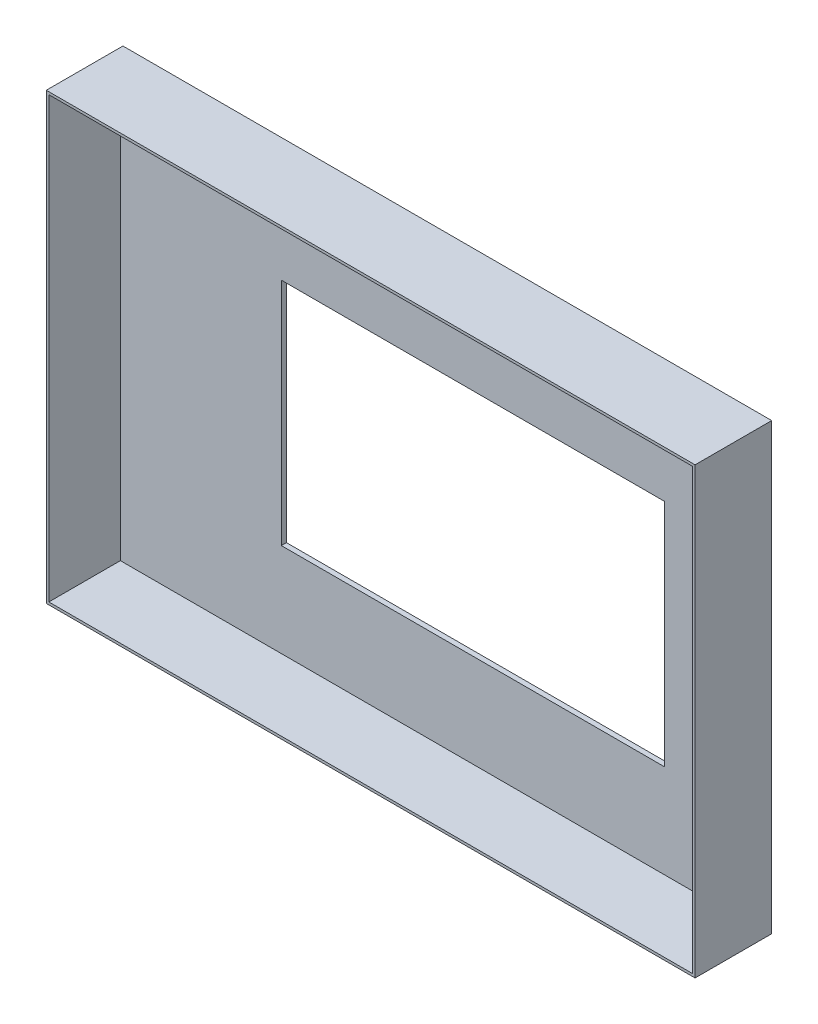
ISO-10303-21;
HEADER;
FILE_DESCRIPTION(('STEP AP214'),'2;1');
FILE_NAME('part.step','',(''),(''),'','','');
FILE_SCHEMA(('AUTOMOTIVE_DESIGN { 1 0 10303 214 1 1 1 1 }'));
ENDSEC;
DATA;
#1=APPLICATION_CONTEXT('core data for automotive mechanical design processes');
#2=APPLICATION_PROTOCOL_DEFINITION('international standard','automotive_design',2000,#1);
#3=PRODUCT_CONTEXT('',#1,'mechanical');
#4=PRODUCT('Part','Part','',(#3));
#5=PRODUCT_RELATED_PRODUCT_CATEGORY('part','',(#4));
#6=PRODUCT_DEFINITION_FORMATION('','',#4);
#7=PRODUCT_DEFINITION_CONTEXT('part definition',#1,'design');
#8=PRODUCT_DEFINITION('design','',#6,#7);
#9=PRODUCT_DEFINITION_SHAPE('','',#8);
#10=(LENGTH_UNIT() NAMED_UNIT(*) SI_UNIT(.MILLI.,.METRE.));
#11=(NAMED_UNIT(*) PLANE_ANGLE_UNIT() SI_UNIT($,.RADIAN.));
#12=(NAMED_UNIT(*) SI_UNIT($,.STERADIAN.) SOLID_ANGLE_UNIT());
#13=UNCERTAINTY_MEASURE_WITH_UNIT(LENGTH_MEASURE(1.E-05),#10,'distance_accuracy_value','');
#14=(GEOMETRIC_REPRESENTATION_CONTEXT(3) GLOBAL_UNCERTAINTY_ASSIGNED_CONTEXT((#13)) GLOBAL_UNIT_ASSIGNED_CONTEXT((#10,
#11,#12)) REPRESENTATION_CONTEXT('',''));
#15=CARTESIAN_POINT('',(0.,0.,0.));
#16=DIRECTION('',(0.,0.,1.));
#17=DIRECTION('',(1.,0.,0.));
#18=AXIS2_PLACEMENT_3D('',#15,#16,#17);
#19=CARTESIAN_POINT('',(0.,0.,0.999999999999999));
#20=DIRECTION('',(0.,0.,1.));
#21=DIRECTION('',(1.,0.,0.));
#22=AXIS2_PLACEMENT_3D('',#19,#20,#21);
#23=PLANE('',#22);
#24=DIRECTION('',(0.,-1.,0.));
#25=VECTOR('',#24,1.);
#26=CARTESIAN_POINT('',(-61.095,26.805,0.999999999999999));
#27=LINE('',#26,#25);
#28=CARTESIAN_POINT('',(-61.095,26.805,0.999999999999999));
#29=VERTEX_POINT('',#28);
#30=CARTESIAN_POINT('',(-61.095,-59.195,0.999999999999999));
#31=VERTEX_POINT('',#30);
#32=EDGE_CURVE('E162',#29,#31,#27,.T.);
#33=ORIENTED_EDGE('',*,*,#32,.T.);
#34=DIRECTION('',(1.,0.,0.));
#35=VECTOR('',#34,1.);
#36=CARTESIAN_POINT('',(-61.095,-59.195,0.999999999999999));
#37=LINE('',#36,#35);
#38=CARTESIAN_POINT('',(64.905,-59.195,0.999999999999999));
#39=VERTEX_POINT('',#38);
#40=EDGE_CURVE('E165',#31,#39,#37,.T.);
#41=ORIENTED_EDGE('',*,*,#40,.T.);
#42=DIRECTION('',(0.,1.,0.));
#43=VECTOR('',#42,1.);
#44=CARTESIAN_POINT('',(64.905,26.805,0.999999999999999));
#45=LINE('',#44,#43);
#46=CARTESIAN_POINT('',(64.905,26.805,0.999999999999999));
#47=VERTEX_POINT('',#46);
#48=EDGE_CURVE('E169',#39,#47,#45,.T.);
#49=ORIENTED_EDGE('',*,*,#48,.T.);
#50=DIRECTION('',(-1.,0.,0.));
#51=VECTOR('',#50,1.);
#52=CARTESIAN_POINT('',(-61.095,26.805,0.999999999999999));
#53=LINE('',#52,#51);
#54=EDGE_CURVE('E172',#47,#29,#53,.T.);
#55=ORIENTED_EDGE('',*,*,#54,.T.);
#56=EDGE_LOOP('',(#33,#41,#49,#55));
#57=FACE_BOUND('',#56,.T.);
#58=DIRECTION('',(1.,0.,0.));
#59=VECTOR('',#58,1.);
#60=CARTESIAN_POINT('',(45.405,4.11652592288495,1.));
#61=LINE('',#60,#59);
#62=CARTESIAN_POINT('',(-29.595,4.11652592288495,1.));
#63=VERTEX_POINT('',#62);
#64=CARTESIAN_POINT('',(45.405,4.11652592288495,1.));
#65=VERTEX_POINT('',#64);
#66=EDGE_CURVE('E135',#63,#65,#61,.T.);
#67=ORIENTED_EDGE('',*,*,#66,.T.);
#68=DIRECTION('',(0.,-1.,0.));
#69=VECTOR('',#68,1.);
#70=CARTESIAN_POINT('',(45.405,4.11652592288495,1.));
#71=LINE('',#70,#69);
#72=CARTESIAN_POINT('',(45.405,-40.883474077115,1.));
#73=VERTEX_POINT('',#72);
#74=EDGE_CURVE('E129',#65,#73,#71,.T.);
#75=ORIENTED_EDGE('',*,*,#74,.T.);
#76=DIRECTION('',(-1.,0.,0.));
#77=VECTOR('',#76,1.);
#78=CARTESIAN_POINT('',(45.405,-40.883474077115,1.));
#79=LINE('',#78,#77);
#80=CARTESIAN_POINT('',(-29.595,-40.883474077115,1.));
#81=VERTEX_POINT('',#80);
#82=EDGE_CURVE('E138',#73,#81,#79,.T.);
#83=ORIENTED_EDGE('',*,*,#82,.T.);
#84=DIRECTION('',(0.,1.,0.));
#85=VECTOR('',#84,1.);
#86=CARTESIAN_POINT('',(-29.595,4.11652592288495,1.));
#87=LINE('',#86,#85);
#88=EDGE_CURVE('E53',#81,#63,#87,.T.);
#89=ORIENTED_EDGE('',*,*,#88,.T.);
#90=EDGE_LOOP('',(#67,#75,#83,#89));
#91=FACE_BOUND('',#90,.T.);
#92=ADVANCED_FACE('F38',(#57,#91),#23,.T.);
#93=CARTESIAN_POINT('',(-61.595,27.305,15.));
#94=DIRECTION('',(1.,0.,0.));
#95=DIRECTION('',(0.,1.,0.));
#96=AXIS2_PLACEMENT_3D('',#93,#94,#95);
#97=PLANE('',#96);
#98=DIRECTION('',(0.,-1.,0.));
#99=VECTOR('',#98,1.);
#100=CARTESIAN_POINT('',(-61.595,27.305,0.));
#101=LINE('',#100,#99);
#102=CARTESIAN_POINT('',(-61.595,27.305,0.));
#103=VERTEX_POINT('',#102);
#104=CARTESIAN_POINT('',(-61.595,-59.695,0.));
#105=VERTEX_POINT('',#104);
#106=EDGE_CURVE('E187',#103,#105,#101,.T.);
#107=ORIENTED_EDGE('',*,*,#106,.T.);
#108=DIRECTION('',(0.,0.,-1.));
#109=VECTOR('',#108,1.);
#110=CARTESIAN_POINT('',(-61.595,-59.695,15.));
#111=LINE('',#110,#109);
#112=CARTESIAN_POINT('',(-61.595,-59.695,15.));
#113=VERTEX_POINT('',#112);
#114=EDGE_CURVE('E11',#113,#105,#111,.T.);
#115=ORIENTED_EDGE('',*,*,#114,.F.);
#116=DIRECTION('',(0.,-1.,0.));
#117=VECTOR('',#116,1.);
#118=CARTESIAN_POINT('',(-61.595,27.305,15.));
#119=LINE('',#118,#117);
#120=CARTESIAN_POINT('',(-61.595,27.305,15.));
#121=VERTEX_POINT('',#120);
#122=EDGE_CURVE('E194',#121,#113,#119,.T.);
#123=ORIENTED_EDGE('',*,*,#122,.F.);
#124=DIRECTION('',(0.,0.,-1.));
#125=VECTOR('',#124,1.);
#126=CARTESIAN_POINT('',(-61.595,27.305,15.));
#127=LINE('',#126,#125);
#128=EDGE_CURVE('E204',#121,#103,#127,.T.);
#129=ORIENTED_EDGE('',*,*,#128,.T.);
#130=EDGE_LOOP('',(#107,#115,#123,#129));
#131=FACE_BOUND('',#130,.T.);
#132=ADVANCED_FACE('F40',(#131),#97,.F.);
#133=CARTESIAN_POINT('',(-61.595,-59.695,15.));
#134=DIRECTION('',(0.,1.,0.));
#135=DIRECTION('',(0.,0.,1.));
#136=AXIS2_PLACEMENT_3D('',#133,#134,#135);
#137=PLANE('',#136);
#138=DIRECTION('',(1.,0.,0.));
#139=VECTOR('',#138,1.);
#140=CARTESIAN_POINT('',(-61.595,-59.695,0.));
#141=LINE('',#140,#139);
#142=CARTESIAN_POINT('',(65.405,-59.695,0.));
#143=VERTEX_POINT('',#142);
#144=EDGE_CURVE('E207',#105,#143,#141,.T.);
#145=ORIENTED_EDGE('',*,*,#144,.T.);
#146=DIRECTION('',(0.,0.,-1.));
#147=VECTOR('',#146,1.);
#148=CARTESIAN_POINT('',(65.405,-59.695,15.));
#149=LINE('',#148,#147);
#150=CARTESIAN_POINT('',(65.405,-59.695,15.));
#151=VERTEX_POINT('',#150);
#152=EDGE_CURVE('E46',#151,#143,#149,.T.);
#153=ORIENTED_EDGE('',*,*,#152,.F.);
#154=DIRECTION('',(1.,0.,0.));
#155=VECTOR('',#154,1.);
#156=CARTESIAN_POINT('',(-61.595,-59.695,15.));
#157=LINE('',#156,#155);
#158=EDGE_CURVE('E197',#113,#151,#157,.T.);
#159=ORIENTED_EDGE('',*,*,#158,.F.);
#160=ORIENTED_EDGE('',*,*,#114,.T.);
#161=EDGE_LOOP('',(#145,#153,#159,#160));
#162=FACE_BOUND('',#161,.T.);
#163=ADVANCED_FACE('F237',(#162),#137,.F.);
#164=CARTESIAN_POINT('',(65.405,27.305,15.));
#165=DIRECTION('',(-1.,0.,0.));
#166=DIRECTION('',(0.,-1.,0.));
#167=AXIS2_PLACEMENT_3D('',#164,#165,#166);
#168=PLANE('',#167);
#169=DIRECTION('',(0.,1.,0.));
#170=VECTOR('',#169,1.);
#171=CARTESIAN_POINT('',(65.405,27.305,0.));
#172=LINE('',#171,#170);
#173=CARTESIAN_POINT('',(65.405,27.305,0.));
#174=VERTEX_POINT('',#173);
#175=EDGE_CURVE('E209',#143,#174,#172,.T.);
#176=ORIENTED_EDGE('',*,*,#175,.T.);
#177=DIRECTION('',(0.,0.,-1.));
#178=VECTOR('',#177,1.);
#179=CARTESIAN_POINT('',(65.405,27.305,15.));
#180=LINE('',#179,#178);
#181=CARTESIAN_POINT('',(65.405,27.305,15.));
#182=VERTEX_POINT('',#181);
#183=EDGE_CURVE('E214',#182,#174,#180,.T.);
#184=ORIENTED_EDGE('',*,*,#183,.F.);
#185=DIRECTION('',(0.,1.,0.));
#186=VECTOR('',#185,1.);
#187=CARTESIAN_POINT('',(65.405,27.305,15.));
#188=LINE('',#187,#186);
#189=EDGE_CURVE('E200',#151,#182,#188,.T.);
#190=ORIENTED_EDGE('',*,*,#189,.F.);
#191=ORIENTED_EDGE('',*,*,#152,.T.);
#192=EDGE_LOOP('',(#176,#184,#190,#191));
#193=FACE_BOUND('',#192,.T.);
#194=ADVANCED_FACE('F221',(#193),#168,.F.);
#195=CARTESIAN_POINT('',(-61.595,27.305,15.));
#196=DIRECTION('',(0.,-1.,0.));
#197=DIRECTION('',(0.,0.,-1.));
#198=AXIS2_PLACEMENT_3D('',#195,#196,#197);
#199=PLANE('',#198);
#200=DIRECTION('',(-1.,0.,0.));
#201=VECTOR('',#200,1.);
#202=CARTESIAN_POINT('',(-61.595,27.305,0.));
#203=LINE('',#202,#201);
#204=EDGE_CURVE('E198',#174,#103,#203,.T.);
#205=ORIENTED_EDGE('',*,*,#204,.T.);
#206=ORIENTED_EDGE('',*,*,#128,.F.);
#207=DIRECTION('',(-1.,0.,0.));
#208=VECTOR('',#207,1.);
#209=CARTESIAN_POINT('',(-61.595,27.305,15.));
#210=LINE('',#209,#208);
#211=EDGE_CURVE('E202',#182,#121,#210,.T.);
#212=ORIENTED_EDGE('',*,*,#211,.F.);
#213=ORIENTED_EDGE('',*,*,#183,.T.);
#214=EDGE_LOOP('',(#205,#206,#212,#213));
#215=FACE_BOUND('',#214,.T.);
#216=ADVANCED_FACE('F230',(#215),#199,.F.);
#217=CARTESIAN_POINT('',(0.,0.,15.));
#218=DIRECTION('',(0.,0.,1.));
#219=DIRECTION('',(1.,0.,0.));
#220=AXIS2_PLACEMENT_3D('',#217,#218,#219);
#221=PLANE('',#220);
#222=DIRECTION('',(0.,-1.,0.));
#223=VECTOR('',#222,1.);
#224=CARTESIAN_POINT('',(-61.095,26.805,15.));
#225=LINE('',#224,#223);
#226=CARTESIAN_POINT('',(-61.095,26.805,15.));
#227=VERTEX_POINT('',#226);
#228=CARTESIAN_POINT('',(-61.095,-59.195,15.));
#229=VERTEX_POINT('',#228);
#230=EDGE_CURVE('E158',#227,#229,#225,.T.);
#231=ORIENTED_EDGE('',*,*,#230,.F.);
#232=DIRECTION('',(-1.,0.,0.));
#233=VECTOR('',#232,1.);
#234=CARTESIAN_POINT('',(-61.095,26.805,15.));
#235=LINE('',#234,#233);
#236=CARTESIAN_POINT('',(64.905,26.805,15.));
#237=VERTEX_POINT('',#236);
#238=EDGE_CURVE('E166',#237,#227,#235,.T.);
#239=ORIENTED_EDGE('',*,*,#238,.F.);
#240=DIRECTION('',(0.,1.,0.));
#241=VECTOR('',#240,1.);
#242=CARTESIAN_POINT('',(64.905,26.805,15.));
#243=LINE('',#242,#241);
#244=CARTESIAN_POINT('',(64.905,-59.195,15.));
#245=VERTEX_POINT('',#244);
#246=EDGE_CURVE('E180',#245,#237,#243,.T.);
#247=ORIENTED_EDGE('',*,*,#246,.F.);
#248=DIRECTION('',(1.,0.,0.));
#249=VECTOR('',#248,1.);
#250=CARTESIAN_POINT('',(-61.095,-59.195,15.));
#251=LINE('',#250,#249);
#252=EDGE_CURVE('E177',#229,#245,#251,.T.);
#253=ORIENTED_EDGE('',*,*,#252,.F.);
#254=EDGE_LOOP('',(#231,#239,#247,#253));
#255=FACE_BOUND('',#254,.T.);
#256=ORIENTED_EDGE('',*,*,#122,.T.);
#257=ORIENTED_EDGE('',*,*,#158,.T.);
#258=ORIENTED_EDGE('',*,*,#189,.T.);
#259=ORIENTED_EDGE('',*,*,#211,.T.);
#260=EDGE_LOOP('',(#256,#257,#258,#259));
#261=FACE_BOUND('',#260,.T.);
#262=ADVANCED_FACE('F236',(#255,#261),#221,.T.);
#263=CARTESIAN_POINT('',(0.,0.,0.));
#264=DIRECTION('',(0.,0.,1.));
#265=DIRECTION('',(1.,0.,0.));
#266=AXIS2_PLACEMENT_3D('',#263,#264,#265);
#267=PLANE('',#266);
#268=DIRECTION('',(-1.,0.,0.));
#269=VECTOR('',#268,1.);
#270=CARTESIAN_POINT('',(45.405,-40.883474077115,0.));
#271=LINE('',#270,#269);
#272=CARTESIAN_POINT('',(45.405,-40.883474077115,0.));
#273=VERTEX_POINT('',#272);
#274=CARTESIAN_POINT('',(-29.595,-40.883474077115,0.));
#275=VERTEX_POINT('',#274);
#276=EDGE_CURVE('E152',#273,#275,#271,.T.);
#277=ORIENTED_EDGE('',*,*,#276,.F.);
#278=DIRECTION('',(0.,-1.,0.));
#279=VECTOR('',#278,1.);
#280=CARTESIAN_POINT('',(45.405,4.11652592288495,0.));
#281=LINE('',#280,#279);
#282=CARTESIAN_POINT('',(45.405,4.11652592288495,0.));
#283=VERTEX_POINT('',#282);
#284=EDGE_CURVE('E61',#283,#273,#281,.T.);
#285=ORIENTED_EDGE('',*,*,#284,.F.);
#286=DIRECTION('',(1.,0.,0.));
#287=VECTOR('',#286,1.);
#288=CARTESIAN_POINT('',(45.405,4.11652592288495,0.));
#289=LINE('',#288,#287);
#290=CARTESIAN_POINT('',(-29.595,4.11652592288495,0.));
#291=VERTEX_POINT('',#290);
#292=EDGE_CURVE('E143',#291,#283,#289,.T.);
#293=ORIENTED_EDGE('',*,*,#292,.F.);
#294=DIRECTION('',(0.,1.,0.));
#295=VECTOR('',#294,1.);
#296=CARTESIAN_POINT('',(-29.595,4.11652592288495,0.));
#297=LINE('',#296,#295);
#298=EDGE_CURVE('E146',#275,#291,#297,.T.);
#299=ORIENTED_EDGE('',*,*,#298,.F.);
#300=EDGE_LOOP('',(#277,#285,#293,#299));
#301=FACE_BOUND('',#300,.T.);
#302=ORIENTED_EDGE('',*,*,#106,.F.);
#303=ORIENTED_EDGE('',*,*,#204,.F.);
#304=ORIENTED_EDGE('',*,*,#175,.F.);
#305=ORIENTED_EDGE('',*,*,#144,.F.);
#306=EDGE_LOOP('',(#302,#303,#304,#305));
#307=FACE_BOUND('',#306,.T.);
#308=ADVANCED_FACE('F227',(#301,#307),#267,.F.);
#309=CARTESIAN_POINT('',(-61.095,26.805,0.999999999999999));
#310=DIRECTION('',(-1.,0.,0.));
#311=DIRECTION('',(0.,-1.,0.));
#312=AXIS2_PLACEMENT_3D('',#309,#310,#311);
#313=PLANE('',#312);
#314=ORIENTED_EDGE('',*,*,#230,.T.);
#315=DIRECTION('',(0.,0.,1.));
#316=VECTOR('',#315,1.);
#317=CARTESIAN_POINT('',(-61.095,-59.195,0.999999999999999));
#318=LINE('',#317,#316);
#319=EDGE_CURVE('E175',#31,#229,#318,.T.);
#320=ORIENTED_EDGE('',*,*,#319,.F.);
#321=ORIENTED_EDGE('',*,*,#32,.F.);
#322=DIRECTION('',(0.,0.,1.));
#323=VECTOR('',#322,1.);
#324=CARTESIAN_POINT('',(-61.095,26.805,0.999999999999999));
#325=LINE('',#324,#323);
#326=EDGE_CURVE('E185',#29,#227,#325,.T.);
#327=ORIENTED_EDGE('',*,*,#326,.T.);
#328=EDGE_LOOP('',(#314,#320,#321,#327));
#329=FACE_BOUND('',#328,.T.);
#330=ADVANCED_FACE('F256',(#329),#313,.F.);
#331=CARTESIAN_POINT('',(-61.095,26.805,0.999999999999999));
#332=DIRECTION('',(0.,1.,0.));
#333=DIRECTION('',(0.,0.,1.));
#334=AXIS2_PLACEMENT_3D('',#331,#332,#333);
#335=PLANE('',#334);
#336=ORIENTED_EDGE('',*,*,#238,.T.);
#337=ORIENTED_EDGE('',*,*,#326,.F.);
#338=ORIENTED_EDGE('',*,*,#54,.F.);
#339=DIRECTION('',(0.,0.,1.));
#340=VECTOR('',#339,1.);
#341=CARTESIAN_POINT('',(64.905,26.805,0.999999999999999));
#342=LINE('',#341,#340);
#343=EDGE_CURVE('E188',#47,#237,#342,.T.);
#344=ORIENTED_EDGE('',*,*,#343,.T.);
#345=EDGE_LOOP('',(#336,#337,#338,#344));
#346=FACE_BOUND('',#345,.T.);
#347=ADVANCED_FACE('F252',(#346),#335,.F.);
#348=CARTESIAN_POINT('',(64.905,26.805,0.999999999999999));
#349=DIRECTION('',(1.,0.,0.));
#350=DIRECTION('',(0.,1.,0.));
#351=AXIS2_PLACEMENT_3D('',#348,#349,#350);
#352=PLANE('',#351);
#353=ORIENTED_EDGE('',*,*,#246,.T.);
#354=ORIENTED_EDGE('',*,*,#343,.F.);
#355=ORIENTED_EDGE('',*,*,#48,.F.);
#356=DIRECTION('',(0.,0.,1.));
#357=VECTOR('',#356,1.);
#358=CARTESIAN_POINT('',(64.905,-59.195,0.999999999999999));
#359=LINE('',#358,#357);
#360=EDGE_CURVE('E190',#39,#245,#359,.T.);
#361=ORIENTED_EDGE('',*,*,#360,.T.);
#362=EDGE_LOOP('',(#353,#354,#355,#361));
#363=FACE_BOUND('',#362,.T.);
#364=ADVANCED_FACE('F255',(#363),#352,.F.);
#365=CARTESIAN_POINT('',(-61.095,-59.195,0.999999999999999));
#366=DIRECTION('',(0.,-1.,0.));
#367=DIRECTION('',(0.,0.,-1.));
#368=AXIS2_PLACEMENT_3D('',#365,#366,#367);
#369=PLANE('',#368);
#370=ORIENTED_EDGE('',*,*,#252,.T.);
#371=ORIENTED_EDGE('',*,*,#360,.F.);
#372=ORIENTED_EDGE('',*,*,#40,.F.);
#373=ORIENTED_EDGE('',*,*,#319,.T.);
#374=EDGE_LOOP('',(#370,#371,#372,#373));
#375=FACE_BOUND('',#374,.T.);
#376=ADVANCED_FACE('F260',(#375),#369,.F.);
#377=CARTESIAN_POINT('',(45.405,4.11652592288495,1.));
#378=DIRECTION('',(1.,0.,0.));
#379=DIRECTION('',(0.,1.,0.));
#380=AXIS2_PLACEMENT_3D('',#377,#378,#379);
#381=PLANE('',#380);
#382=ORIENTED_EDGE('',*,*,#284,.T.);
#383=DIRECTION('',(0.,0.,-1.));
#384=VECTOR('',#383,1.);
#385=CARTESIAN_POINT('',(45.405,-40.883474077115,1.));
#386=LINE('',#385,#384);
#387=EDGE_CURVE('E125',#73,#273,#386,.T.);
#388=ORIENTED_EDGE('',*,*,#387,.F.);
#389=ORIENTED_EDGE('',*,*,#74,.F.);
#390=DIRECTION('',(0.,0.,-1.));
#391=VECTOR('',#390,1.);
#392=CARTESIAN_POINT('',(45.405,4.11652592288495,1.));
#393=LINE('',#392,#391);
#394=EDGE_CURVE('E156',#65,#283,#393,.T.);
#395=ORIENTED_EDGE('',*,*,#394,.T.);
#396=EDGE_LOOP('',(#382,#388,#389,#395));
#397=FACE_BOUND('',#396,.T.);
#398=ADVANCED_FACE('F127',(#397),#381,.F.);
#399=CARTESIAN_POINT('',(45.405,4.11652592288495,1.));
#400=DIRECTION('',(0.,1.,0.));
#401=DIRECTION('',(0.,0.,1.));
#402=AXIS2_PLACEMENT_3D('',#399,#400,#401);
#403=PLANE('',#402);
#404=ORIENTED_EDGE('',*,*,#292,.T.);
#405=ORIENTED_EDGE('',*,*,#394,.F.);
#406=ORIENTED_EDGE('',*,*,#66,.F.);
#407=DIRECTION('',(0.,0.,-1.));
#408=VECTOR('',#407,1.);
#409=CARTESIAN_POINT('',(-29.595,4.11652592288495,1.));
#410=LINE('',#409,#408);
#411=EDGE_CURVE('E159',#63,#291,#410,.T.);
#412=ORIENTED_EDGE('',*,*,#411,.T.);
#413=EDGE_LOOP('',(#404,#405,#406,#412));
#414=FACE_BOUND('',#413,.T.);
#415=ADVANCED_FACE('F309',(#414),#403,.F.);
#416=CARTESIAN_POINT('',(-29.595,4.11652592288495,1.));
#417=DIRECTION('',(-1.,0.,0.));
#418=DIRECTION('',(0.,-1.,0.));
#419=AXIS2_PLACEMENT_3D('',#416,#417,#418);
#420=PLANE('',#419);
#421=ORIENTED_EDGE('',*,*,#298,.T.);
#422=ORIENTED_EDGE('',*,*,#411,.F.);
#423=ORIENTED_EDGE('',*,*,#88,.F.);
#424=DIRECTION('',(0.,0.,-1.));
#425=VECTOR('',#424,1.);
#426=CARTESIAN_POINT('',(-29.595,-40.883474077115,1.));
#427=LINE('',#426,#425);
#428=EDGE_CURVE('E134',#81,#275,#427,.T.);
#429=ORIENTED_EDGE('',*,*,#428,.T.);
#430=EDGE_LOOP('',(#421,#422,#423,#429));
#431=FACE_BOUND('',#430,.T.);
#432=ADVANCED_FACE('F315',(#431),#420,.F.);
#433=CARTESIAN_POINT('',(45.405,-40.883474077115,1.));
#434=DIRECTION('',(0.,-1.,0.));
#435=DIRECTION('',(0.,0.,-1.));
#436=AXIS2_PLACEMENT_3D('',#433,#434,#435);
#437=PLANE('',#436);
#438=ORIENTED_EDGE('',*,*,#276,.T.);
#439=ORIENTED_EDGE('',*,*,#428,.F.);
#440=ORIENTED_EDGE('',*,*,#82,.F.);
#441=ORIENTED_EDGE('',*,*,#387,.T.);
#442=EDGE_LOOP('',(#438,#439,#440,#441));
#443=FACE_BOUND('',#442,.T.);
#444=ADVANCED_FACE('F139',(#443),#437,.F.);
#445=CLOSED_SHELL('',(#92,#132,#163,#194,#216,#262,#308,#330,#347,#364,#376,#398,#415,#432,#444));
#446=MANIFOLD_SOLID_BREP('B2',#445);
#447=ADVANCED_BREP_SHAPE_REPRESENTATION('',(#18,#446),#14);
#448=SHAPE_DEFINITION_REPRESENTATION(#9,#447);
ENDSEC;
END-ISO-10303-21;
